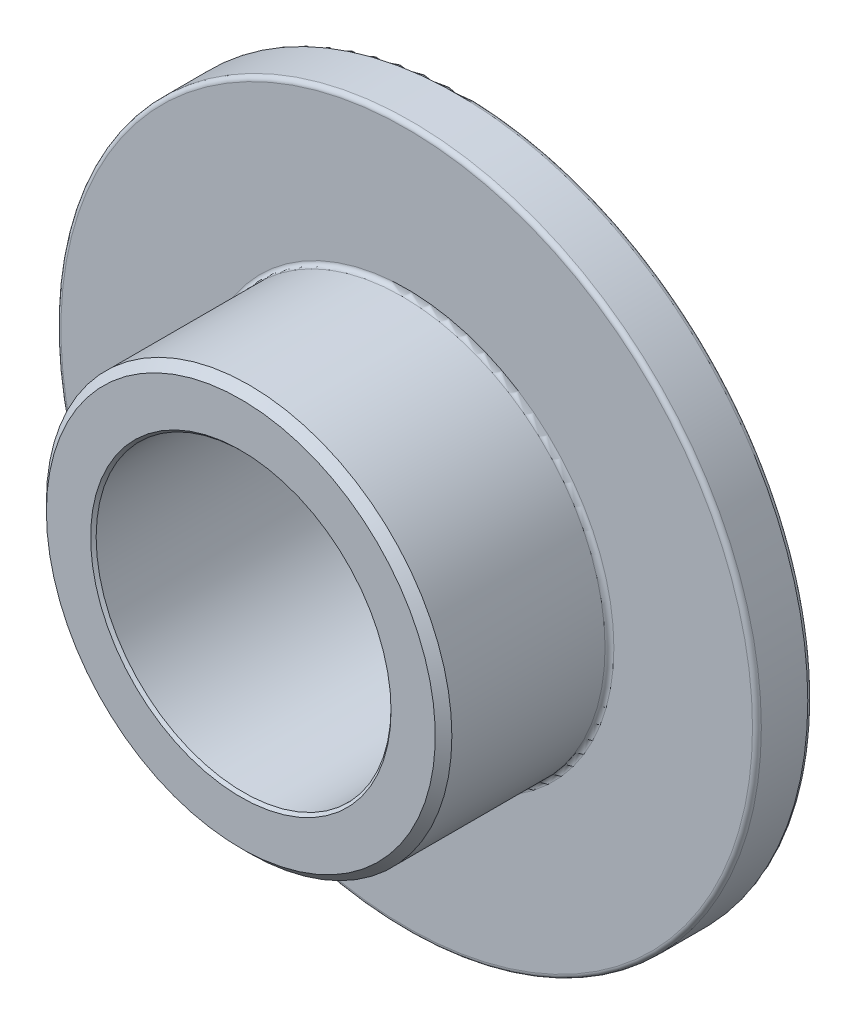
ISO-10303-21;
HEADER;
FILE_DESCRIPTION(('STEP AP214'),'2;1');
FILE_NAME('part.step','',(''),(''),'','','');
FILE_SCHEMA(('AUTOMOTIVE_DESIGN { 1 0 10303 214 1 1 1 1 }'));
ENDSEC;
DATA;
#1=APPLICATION_CONTEXT('core data for automotive mechanical design processes');
#2=APPLICATION_PROTOCOL_DEFINITION('international standard','automotive_design',2000,#1);
#3=PRODUCT_CONTEXT('',#1,'mechanical');
#4=PRODUCT('Part','Part','',(#3));
#5=PRODUCT_RELATED_PRODUCT_CATEGORY('part','',(#4));
#6=PRODUCT_DEFINITION_FORMATION('','',#4);
#7=PRODUCT_DEFINITION_CONTEXT('part definition',#1,'design');
#8=PRODUCT_DEFINITION('design','',#6,#7);
#9=PRODUCT_DEFINITION_SHAPE('','',#8);
#10=(LENGTH_UNIT() NAMED_UNIT(*) SI_UNIT(.MILLI.,.METRE.));
#11=(NAMED_UNIT(*) PLANE_ANGLE_UNIT() SI_UNIT($,.RADIAN.));
#12=(NAMED_UNIT(*) SI_UNIT($,.STERADIAN.) SOLID_ANGLE_UNIT());
#13=UNCERTAINTY_MEASURE_WITH_UNIT(LENGTH_MEASURE(1.E-05),#10,'distance_accuracy_value','');
#14=(GEOMETRIC_REPRESENTATION_CONTEXT(3) GLOBAL_UNCERTAINTY_ASSIGNED_CONTEXT((#13)) GLOBAL_UNIT_ASSIGNED_CONTEXT((#10,
#11,#12)) REPRESENTATION_CONTEXT('',''));
#15=CARTESIAN_POINT('',(0.,0.,0.));
#16=DIRECTION('',(0.,0.,1.));
#17=DIRECTION('',(1.,0.,0.));
#18=AXIS2_PLACEMENT_3D('',#15,#16,#17);
#19=CARTESIAN_POINT('',(0.,-2.,-1.5));
#20=DIRECTION('',(0.,0.,-1.));
#21=DIRECTION('',(-1.,0.,0.));
#22=AXIS2_PLACEMENT_3D('',#19,#20,#21);
#23=PLANE('',#22);
#24=CARTESIAN_POINT('',(0.,0.,-1.5));
#25=DIRECTION('',(0.,0.,-1.));
#26=DIRECTION('',(-1.,0.,0.));
#27=AXIS2_PLACEMENT_3D('',#24,#25,#26);
#28=CIRCLE('',#27,4.69);
#29=CARTESIAN_POINT('',(-4.69,0.,-1.5));
#30=VERTEX_POINT('',#29);
#31=EDGE_CURVE('E49',#30,#30,#28,.T.);
#32=ORIENTED_EDGE('',*,*,#31,.T.);
#33=EDGE_LOOP('',(#32));
#34=FACE_BOUND('',#33,.T.);
#35=CARTESIAN_POINT('',(0.,0.,-1.5));
#36=DIRECTION('',(0.,0.,-1.));
#37=DIRECTION('',(-1.,0.,0.));
#38=AXIS2_PLACEMENT_3D('',#35,#36,#37);
#39=CIRCLE('',#38,2.0375);
#40=CARTESIAN_POINT('',(-2.0375,0.,-1.5));
#41=VERTEX_POINT('',#40);
#42=EDGE_CURVE('E69',#41,#41,#39,.F.);
#43=ORIENTED_EDGE('',*,*,#42,.T.);
#44=EDGE_LOOP('',(#43));
#45=FACE_BOUND('',#44,.T.);
#46=ADVANCED_FACE('F34',(#34,#45),#23,.T.);
#47=CARTESIAN_POINT('',(0.,0.,1.5));
#48=DIRECTION('',(0.,0.,1.));
#49=DIRECTION('',(1.,0.,0.));
#50=AXIS2_PLACEMENT_3D('',#47,#48,#49);
#51=CYLINDRICAL_SURFACE('',#50,4.75);
#52=CARTESIAN_POINT('',(0.,0.,-1.44));
#53=DIRECTION('',(0.,0.,-1.));
#54=DIRECTION('',(-1.,0.,0.));
#55=AXIS2_PLACEMENT_3D('',#52,#53,#54);
#56=CIRCLE('',#55,4.75);
#57=CARTESIAN_POINT('',(-4.75,0.,-1.44));
#58=VERTEX_POINT('',#57);
#59=EDGE_CURVE('E54',#58,#58,#56,.F.);
#60=ORIENTED_EDGE('',*,*,#59,.T.);
#61=EDGE_LOOP('',(#60));
#62=FACE_BOUND('',#61,.T.);
#63=CARTESIAN_POINT('',(0.,0.,-0.810000000000001));
#64=DIRECTION('',(0.,0.,1.));
#65=DIRECTION('',(1.,0.,0.));
#66=AXIS2_PLACEMENT_3D('',#63,#64,#65);
#67=CIRCLE('',#66,4.75);
#68=CARTESIAN_POINT('',(4.75,0.,-0.810000000000001));
#69=VERTEX_POINT('',#68);
#70=EDGE_CURVE('E57',#69,#69,#67,.F.);
#71=ORIENTED_EDGE('',*,*,#70,.T.);
#72=EDGE_LOOP('',(#71));
#73=FACE_BOUND('',#72,.T.);
#74=ADVANCED_FACE('F99',(#62,#73),#51,.T.);
#75=CARTESIAN_POINT('',(0.,-4.75,-0.750000000000001));
#76=DIRECTION('',(0.,0.,1.));
#77=DIRECTION('',(1.,0.,0.));
#78=AXIS2_PLACEMENT_3D('',#75,#76,#77);
#79=PLANE('',#78);
#80=CARTESIAN_POINT('',(0.,0.,-0.750000000000001));
#81=DIRECTION('',(0.,0.,1.));
#82=DIRECTION('',(1.,0.,0.));
#83=AXIS2_PLACEMENT_3D('',#80,#81,#82);
#84=CIRCLE('',#83,2.81);
#85=CARTESIAN_POINT('',(2.81,0.,-0.750000000000001));
#86=VERTEX_POINT('',#85);
#87=EDGE_CURVE('E10',#86,#86,#84,.F.);
#88=ORIENTED_EDGE('',*,*,#87,.T.);
#89=EDGE_LOOP('',(#88));
#90=FACE_BOUND('',#89,.T.);
#91=CARTESIAN_POINT('',(0.,0.,-0.750000000000001));
#92=DIRECTION('',(0.,0.,1.));
#93=DIRECTION('',(1.,0.,0.));
#94=AXIS2_PLACEMENT_3D('',#91,#92,#93);
#95=CIRCLE('',#94,4.69);
#96=CARTESIAN_POINT('',(4.69,0.,-0.750000000000001));
#97=VERTEX_POINT('',#96);
#98=EDGE_CURVE('E41',#97,#97,#95,.T.);
#99=ORIENTED_EDGE('',*,*,#98,.T.);
#100=EDGE_LOOP('',(#99));
#101=FACE_BOUND('',#100,.T.);
#102=ADVANCED_FACE('F104',(#90,#101),#79,.T.);
#103=CARTESIAN_POINT('',(0.,0.,1.5));
#104=DIRECTION('',(0.,0.,1.));
#105=DIRECTION('',(1.,0.,0.));
#106=AXIS2_PLACEMENT_3D('',#103,#104,#105);
#107=CYLINDRICAL_SURFACE('',#106,2.75);
#108=CARTESIAN_POINT('',(0.,0.,-0.690000000000001));
#109=DIRECTION('',(0.,0.,1.));
#110=DIRECTION('',(1.,0.,0.));
#111=AXIS2_PLACEMENT_3D('',#108,#109,#110);
#112=CIRCLE('',#111,2.75);
#113=CARTESIAN_POINT('',(2.75,0.,-0.690000000000001));
#114=VERTEX_POINT('',#113);
#115=EDGE_CURVE('E45',#114,#114,#112,.T.);
#116=ORIENTED_EDGE('',*,*,#115,.T.);
#117=EDGE_LOOP('',(#116));
#118=FACE_BOUND('',#117,.T.);
#119=CARTESIAN_POINT('',(0.,0.,1.3875));
#120=DIRECTION('',(0.,0.,1.));
#121=DIRECTION('',(1.,0.,0.));
#122=AXIS2_PLACEMENT_3D('',#119,#120,#121);
#123=CIRCLE('',#122,2.75);
#124=CARTESIAN_POINT('',(-2.75,0.,1.3875));
#125=VERTEX_POINT('',#124);
#126=EDGE_CURVE('E72',#125,#125,#123,.F.);
#127=ORIENTED_EDGE('',*,*,#126,.T.);
#128=EDGE_LOOP('',(#127));
#129=FACE_BOUND('',#128,.T.);
#130=ADVANCED_FACE('F111',(#118,#129),#107,.T.);
#131=CARTESIAN_POINT('',(0.,-2.75,1.5));
#132=DIRECTION('',(0.,0.,1.));
#133=DIRECTION('',(1.,0.,0.));
#134=AXIS2_PLACEMENT_3D('',#131,#132,#133);
#135=PLANE('',#134);
#136=CARTESIAN_POINT('',(0.,0.,1.5));
#137=DIRECTION('',(0.,0.,1.));
#138=DIRECTION('',(1.,0.,0.));
#139=AXIS2_PLACEMENT_3D('',#136,#137,#138);
#140=CIRCLE('',#139,2.0375);
#141=CARTESIAN_POINT('',(2.0375,0.,1.5));
#142=VERTEX_POINT('',#141);
#143=EDGE_CURVE('E60',#142,#142,#140,.F.);
#144=ORIENTED_EDGE('',*,*,#143,.T.);
#145=EDGE_LOOP('',(#144));
#146=FACE_BOUND('',#145,.T.);
#147=CARTESIAN_POINT('',(0.,0.,1.5));
#148=DIRECTION('',(0.,0.,1.));
#149=DIRECTION('',(1.,0.,0.));
#150=AXIS2_PLACEMENT_3D('',#147,#148,#149);
#151=CIRCLE('',#150,2.6375);
#152=CARTESIAN_POINT('',(-2.6375,0.,1.5));
#153=VERTEX_POINT('',#152);
#154=EDGE_CURVE('E75',#153,#153,#151,.T.);
#155=ORIENTED_EDGE('',*,*,#154,.T.);
#156=EDGE_LOOP('',(#155));
#157=FACE_BOUND('',#156,.T.);
#158=ADVANCED_FACE('F79',(#146,#157),#135,.T.);
#159=CARTESIAN_POINT('',(0.,0.,1.5));
#160=DIRECTION('',(0.,0.,1.));
#161=DIRECTION('',(1.,0.,0.));
#162=AXIS2_PLACEMENT_3D('',#159,#160,#161);
#163=CYLINDRICAL_SURFACE('',#162,2.);
#164=CARTESIAN_POINT('',(0.,0.,-1.4625));
#165=DIRECTION('',(0.,0.,-1.));
#166=DIRECTION('',(-1.,0.,0.));
#167=AXIS2_PLACEMENT_3D('',#164,#165,#166);
#168=CIRCLE('',#167,2.);
#169=CARTESIAN_POINT('',(-2.,0.,-1.4625));
#170=VERTEX_POINT('',#169);
#171=EDGE_CURVE('E63',#170,#170,#168,.T.);
#172=ORIENTED_EDGE('',*,*,#171,.T.);
#173=EDGE_LOOP('',(#172));
#174=FACE_BOUND('',#173,.T.);
#175=CARTESIAN_POINT('',(0.,0.,1.4625));
#176=DIRECTION('',(0.,0.,1.));
#177=DIRECTION('',(1.,0.,0.));
#178=AXIS2_PLACEMENT_3D('',#175,#176,#177);
#179=CIRCLE('',#178,2.);
#180=CARTESIAN_POINT('',(2.,0.,1.4625));
#181=VERTEX_POINT('',#180);
#182=EDGE_CURVE('E66',#181,#181,#179,.T.);
#183=ORIENTED_EDGE('',*,*,#182,.T.);
#184=EDGE_LOOP('',(#183));
#185=FACE_BOUND('',#184,.T.);
#186=ADVANCED_FACE('F84',(#174,#185),#163,.F.);
#187=CARTESIAN_POINT('',(0.,0.,1.5));
#188=DIRECTION('',(0.,0.,-1.));
#189=DIRECTION('',(-1.,0.,0.));
#190=AXIS2_PLACEMENT_3D('',#187,#188,#189);
#191=CONICAL_SURFACE('',#190,2.6375,0.785398163397448);
#192=CARTESIAN_POINT('',(-2.75,0.,1.3875));
#193=CARTESIAN_POINT('',(-2.748828125,0.,1.388671875));
#194=CARTESIAN_POINT('',(-2.74765625,0.,1.38984375));
#195=CARTESIAN_POINT('',(-2.7453125,0.,1.3921875));
#196=CARTESIAN_POINT('',(-2.744140625,0.,1.393359375));
#197=CARTESIAN_POINT('',(-2.741796875,0.,1.395703125));
#198=CARTESIAN_POINT('',(-2.740625,0.,1.396875));
#199=CARTESIAN_POINT('',(-2.73828125,0.,1.39921875));
#200=CARTESIAN_POINT('',(-2.737109375,0.,1.400390625));
#201=CARTESIAN_POINT('',(-2.734765625,0.,1.402734375));
#202=CARTESIAN_POINT('',(-2.73359375,0.,1.40390625));
#203=CARTESIAN_POINT('',(-2.73125,0.,1.40625));
#204=CARTESIAN_POINT('',(-2.730078125,0.,1.407421875));
#205=CARTESIAN_POINT('',(-2.727734375,0.,1.409765625));
#206=CARTESIAN_POINT('',(-2.7265625,0.,1.4109375));
#207=CARTESIAN_POINT('',(-2.72421875,0.,1.41328125));
#208=CARTESIAN_POINT('',(-2.723046875,0.,1.414453125));
#209=CARTESIAN_POINT('',(-2.720703125,0.,1.416796875));
#210=CARTESIAN_POINT('',(-2.71953125,0.,1.41796875));
#211=CARTESIAN_POINT('',(-2.7171875,0.,1.4203125));
#212=CARTESIAN_POINT('',(-2.716015625,0.,1.421484375));
#213=CARTESIAN_POINT('',(-2.713671875,0.,1.423828125));
#214=CARTESIAN_POINT('',(-2.7125,0.,1.425));
#215=CARTESIAN_POINT('',(-2.71015625,0.,1.42734375));
#216=CARTESIAN_POINT('',(-2.708984375,0.,1.428515625));
#217=CARTESIAN_POINT('',(-2.706640625,0.,1.430859375));
#218=CARTESIAN_POINT('',(-2.70546875,0.,1.43203125));
#219=CARTESIAN_POINT('',(-2.703125,0.,1.434375));
#220=CARTESIAN_POINT('',(-2.701953125,0.,1.435546875));
#221=CARTESIAN_POINT('',(-2.699609375,0.,1.437890625));
#222=CARTESIAN_POINT('',(-2.6984375,0.,1.4390625));
#223=CARTESIAN_POINT('',(-2.69609375,0.,1.44140625));
#224=CARTESIAN_POINT('',(-2.694921875,0.,1.442578125));
#225=CARTESIAN_POINT('',(-2.692578125,0.,1.444921875));
#226=CARTESIAN_POINT('',(-2.69140625,0.,1.44609375));
#227=CARTESIAN_POINT('',(-2.6890625,0.,1.4484375));
#228=CARTESIAN_POINT('',(-2.687890625,0.,1.449609375));
#229=CARTESIAN_POINT('',(-2.685546875,0.,1.451953125));
#230=CARTESIAN_POINT('',(-2.684375,0.,1.453125));
#231=CARTESIAN_POINT('',(-2.68203125,0.,1.45546875));
#232=CARTESIAN_POINT('',(-2.680859375,0.,1.456640625));
#233=CARTESIAN_POINT('',(-2.678515625,0.,1.458984375));
#234=CARTESIAN_POINT('',(-2.67734375,0.,1.46015625));
#235=CARTESIAN_POINT('',(-2.675,0.,1.4625));
#236=CARTESIAN_POINT('',(-2.673828125,0.,1.463671875));
#237=CARTESIAN_POINT('',(-2.671484375,0.,1.466015625));
#238=CARTESIAN_POINT('',(-2.6703125,0.,1.4671875));
#239=CARTESIAN_POINT('',(-2.66796875,0.,1.46953125));
#240=CARTESIAN_POINT('',(-2.666796875,0.,1.470703125));
#241=CARTESIAN_POINT('',(-2.664453125,0.,1.473046875));
#242=CARTESIAN_POINT('',(-2.66328125,0.,1.47421875));
#243=CARTESIAN_POINT('',(-2.6609375,0.,1.4765625));
#244=CARTESIAN_POINT('',(-2.659765625,0.,1.477734375));
#245=CARTESIAN_POINT('',(-2.657421875,0.,1.480078125));
#246=CARTESIAN_POINT('',(-2.65625,0.,1.48125));
#247=CARTESIAN_POINT('',(-2.65390625,0.,1.48359375));
#248=CARTESIAN_POINT('',(-2.652734375,0.,1.484765625));
#249=CARTESIAN_POINT('',(-2.650390625,0.,1.487109375));
#250=CARTESIAN_POINT('',(-2.64921875,0.,1.48828125));
#251=CARTESIAN_POINT('',(-2.646875,0.,1.490625));
#252=CARTESIAN_POINT('',(-2.645703125,0.,1.491796875));
#253=CARTESIAN_POINT('',(-2.643359375,0.,1.494140625));
#254=CARTESIAN_POINT('',(-2.6421875,0.,1.4953125));
#255=CARTESIAN_POINT('',(-2.63984375,0.,1.49765625));
#256=CARTESIAN_POINT('',(-2.638671875,0.,1.498828125));
#257=CARTESIAN_POINT('',(-2.6375,0.,1.5));
#258=B_SPLINE_CURVE_WITH_KNOTS('',3,(#192,#193,#194,#195,#196,#197,#198,#199,#200,#201,#202,
#203,#204,#205,#206,#207,#208,#209,#210,#211,#212,#213,#214,#215,#216,#217,#218,#219,#220,#221,
#222,#223,#224,#225,#226,#227,#228,#229,#230,#231,#232,#233,#234,#235,#236,#237,#238,#239,#240,
#241,#242,#243,#244,#245,#246,#247,#248,#249,#250,#251,#252,#253,#254,#255,#256,#257),
.UNSPECIFIED.,.F.,.F.,(4,2,2,2,2,2,2,2,2,2,2,2,2,2,2,2,2,2,2,2,2,2,2,2,2,2,2,2,2,2,2,2,4),(0.,
0.00497184455521813,0.00994368911043611,0.0149155336656542,0.0198873782208722,
0.0248592227760905,0.0298310673313086,0.0348029118865266,0.0397747564417446,0.0447466009969627,
0.049718445552181,0.0546902901073991,0.0596621346626171,0.0646339792178351,0.0696058237730532,
0.0745776683282715,0.0795495128834895,0.0845213574387076,0.0894932019939256,0.0944650465491437,
0.0994368911043617,0.10440873565958,0.109380580214798,0.114352424770016,0.119324269325234,
0.124296113880452,0.129267958435671,0.134239802990889,0.139211647546107,0.144183492101325,
0.149155336656543,0.154127181211761,0.159099025766979),.UNSPECIFIED.);
#259=EDGE_CURVE('BSEAM81',#125,#153,#258,.T.);
#260=ORIENTED_EDGE('',*,*,#126,.F.);
#261=ORIENTED_EDGE('',*,*,#154,.F.);
#262=ORIENTED_EDGE('',*,*,#259,.T.);
#263=ORIENTED_EDGE('',*,*,#259,.F.);
#264=EDGE_LOOP('',(#260,#262,#261,#263));
#265=FACE_BOUND('',#264,.T.);
#266=ADVANCED_FACE('F81',(#265),#191,.T.);
#267=CARTESIAN_POINT('',(0.,0.,-1.5));
#268=DIRECTION('',(0.,0.,-1.));
#269=DIRECTION('',(-1.,0.,0.));
#270=AXIS2_PLACEMENT_3D('',#267,#268,#269);
#271=CONICAL_SURFACE('',#270,2.0375,0.785398163397437);
#272=ORIENTED_EDGE('',*,*,#171,.F.);
#273=EDGE_LOOP('',(#272));
#274=FACE_BOUND('',#273,.T.);
#275=ORIENTED_EDGE('',*,*,#42,.F.);
#276=EDGE_LOOP('',(#275));
#277=FACE_BOUND('',#276,.T.);
#278=ADVANCED_FACE('F83',(#274,#277),#271,.F.);
#279=CARTESIAN_POINT('',(0.,0.,1.4625));
#280=DIRECTION('',(0.,0.,1.));
#281=DIRECTION('',(1.,0.,0.));
#282=AXIS2_PLACEMENT_3D('',#279,#280,#281);
#283=CONICAL_SURFACE('',#282,2.,0.78539816339746);
#284=ORIENTED_EDGE('',*,*,#143,.F.);
#285=EDGE_LOOP('',(#284));
#286=FACE_BOUND('',#285,.T.);
#287=ORIENTED_EDGE('',*,*,#182,.F.);
#288=EDGE_LOOP('',(#287));
#289=FACE_BOUND('',#288,.T.);
#290=ADVANCED_FACE('F91',(#286,#289),#283,.F.);
#291=CARTESIAN_POINT('',(0.,0.,-1.44));
#292=DIRECTION('',(0.,0.,-1.));
#293=DIRECTION('',(-1.,0.,0.));
#294=AXIS2_PLACEMENT_3D('',#291,#292,#293);
#295=TOROIDAL_SURFACE('',#294,4.69,0.06);
#296=ORIENTED_EDGE('',*,*,#31,.F.);
#297=EDGE_LOOP('',(#296));
#298=FACE_BOUND('',#297,.T.);
#299=ORIENTED_EDGE('',*,*,#59,.F.);
#300=EDGE_LOOP('',(#299));
#301=FACE_BOUND('',#300,.T.);
#302=ADVANCED_FACE('F123',(#298,#301),#295,.T.);
#303=CARTESIAN_POINT('',(0.,0.,-0.690000000000001));
#304=DIRECTION('',(0.,0.,1.));
#305=DIRECTION('',(1.,0.,0.));
#306=AXIS2_PLACEMENT_3D('',#303,#304,#305);
#307=TOROIDAL_SURFACE('',#306,2.81,0.06);
#308=ORIENTED_EDGE('',*,*,#87,.F.);
#309=EDGE_LOOP('',(#308));
#310=FACE_BOUND('',#309,.T.);
#311=ORIENTED_EDGE('',*,*,#115,.F.);
#312=EDGE_LOOP('',(#311));
#313=FACE_BOUND('',#312,.T.);
#314=ADVANCED_FACE('F130',(#310,#313),#307,.F.);
#315=CARTESIAN_POINT('',(0.,0.,-0.810000000000001));
#316=DIRECTION('',(0.,0.,1.));
#317=DIRECTION('',(1.,0.,0.));
#318=AXIS2_PLACEMENT_3D('',#315,#316,#317);
#319=TOROIDAL_SURFACE('',#318,4.69,0.06);
#320=ORIENTED_EDGE('',*,*,#70,.F.);
#321=EDGE_LOOP('',(#320));
#322=FACE_BOUND('',#321,.T.);
#323=ORIENTED_EDGE('',*,*,#98,.F.);
#324=EDGE_LOOP('',(#323));
#325=FACE_BOUND('',#324,.T.);
#326=ADVANCED_FACE('F36',(#322,#325),#319,.T.);
#327=CLOSED_SHELL('',(#46,#74,#102,#130,#158,#186,#266,#278,#290,#302,#314,#326));
#328=MANIFOLD_SOLID_BREP('B2',#327);
#329=ADVANCED_BREP_SHAPE_REPRESENTATION('',(#18,#328),#14);
#330=SHAPE_DEFINITION_REPRESENTATION(#9,#329);
ENDSEC;
END-ISO-10303-21;
